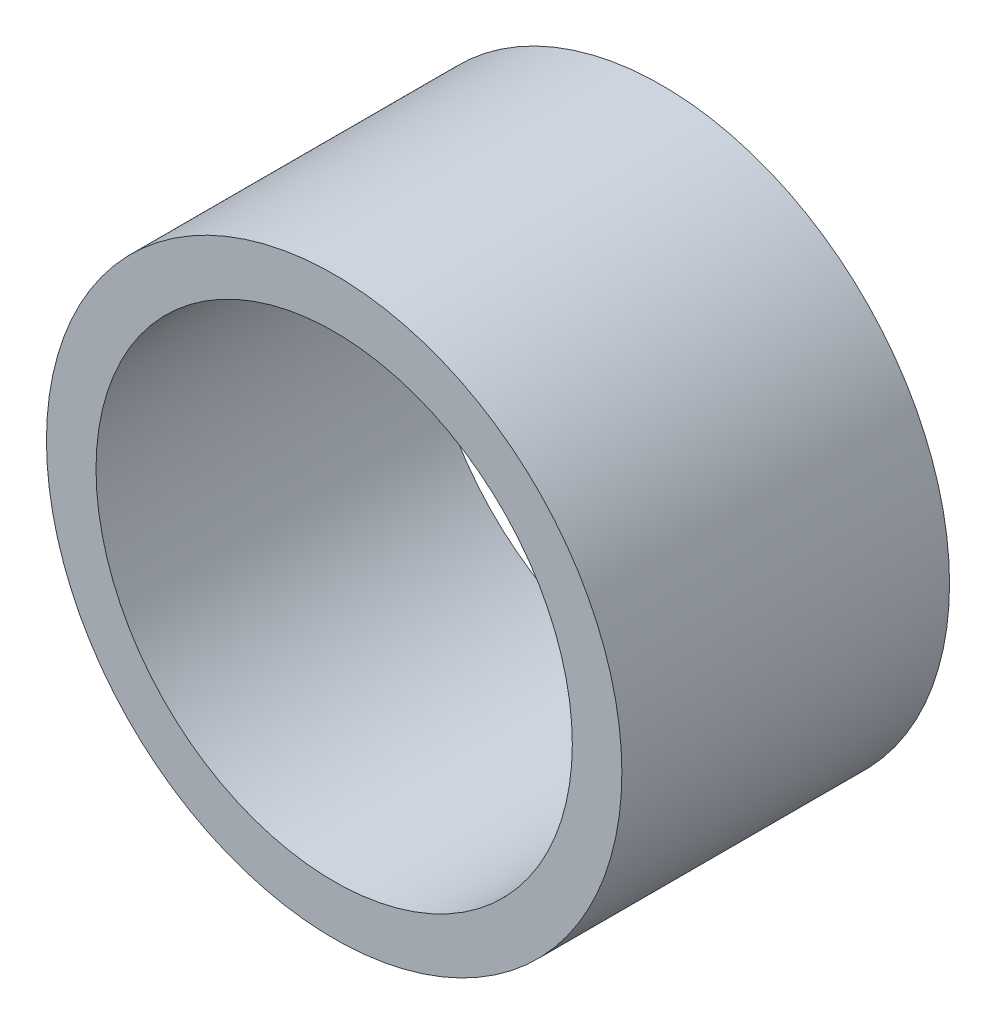
ISO-10303-21;
HEADER;
FILE_DESCRIPTION(('STEP AP214'),'2;1');
FILE_NAME('part.step','',(''),(''),'','','');
FILE_SCHEMA(('AUTOMOTIVE_DESIGN { 1 0 10303 214 1 1 1 1 }'));
ENDSEC;
DATA;
#1=APPLICATION_CONTEXT('core data for automotive mechanical design processes');
#2=APPLICATION_PROTOCOL_DEFINITION('international standard','automotive_design',2000,#1);
#3=PRODUCT_CONTEXT('',#1,'mechanical');
#4=PRODUCT('Part','Part','',(#3));
#5=PRODUCT_RELATED_PRODUCT_CATEGORY('part','',(#4));
#6=PRODUCT_DEFINITION_FORMATION('','',#4);
#7=PRODUCT_DEFINITION_CONTEXT('part definition',#1,'design');
#8=PRODUCT_DEFINITION('design','',#6,#7);
#9=PRODUCT_DEFINITION_SHAPE('','',#8);
#10=(LENGTH_UNIT() NAMED_UNIT(*) SI_UNIT(.MILLI.,.METRE.));
#11=(NAMED_UNIT(*) PLANE_ANGLE_UNIT() SI_UNIT($,.RADIAN.));
#12=(NAMED_UNIT(*) SI_UNIT($,.STERADIAN.) SOLID_ANGLE_UNIT());
#13=UNCERTAINTY_MEASURE_WITH_UNIT(LENGTH_MEASURE(1.E-05),#10,'distance_accuracy_value','');
#14=(GEOMETRIC_REPRESENTATION_CONTEXT(3) GLOBAL_UNCERTAINTY_ASSIGNED_CONTEXT((#13)) GLOBAL_UNIT_ASSIGNED_CONTEXT((#10,
#11,#12)) REPRESENTATION_CONTEXT('',''));
#15=CARTESIAN_POINT('',(0.,0.,0.));
#16=DIRECTION('',(0.,0.,1.));
#17=DIRECTION('',(1.,0.,0.));
#18=AXIS2_PLACEMENT_3D('',#15,#16,#17);
#19=CARTESIAN_POINT('',(0.,0.,41.));
#20=DIRECTION('',(0.,0.,1.));
#21=DIRECTION('',(1.,0.,0.));
#22=AXIS2_PLACEMENT_3D('',#19,#20,#21);
#23=PLANE('',#22);
#24=CARTESIAN_POINT('',(0.,0.,41.));
#25=DIRECTION('',(0.,0.,1.));
#26=DIRECTION('',(1.,0.,0.));
#27=AXIS2_PLACEMENT_3D('',#24,#25,#26);
#28=CIRCLE('',#27,36.);
#29=CARTESIAN_POINT('',(36.,0.,41.));
#30=VERTEX_POINT('',#29);
#31=EDGE_CURVE('E10',#30,#30,#28,.T.);
#32=ORIENTED_EDGE('',*,*,#31,.T.);
#33=EDGE_LOOP('',(#32));
#34=FACE_BOUND('',#33,.T.);
#35=CARTESIAN_POINT('',(0.,0.,41.));
#36=DIRECTION('',(0.,0.,1.));
#37=DIRECTION('',(1.,0.,0.));
#38=AXIS2_PLACEMENT_3D('',#35,#36,#37);
#39=CIRCLE('',#38,29.8);
#40=CARTESIAN_POINT('',(29.8,0.,41.));
#41=VERTEX_POINT('',#40);
#42=EDGE_CURVE('E54',#41,#41,#39,.T.);
#43=ORIENTED_EDGE('',*,*,#42,.F.);
#44=EDGE_LOOP('',(#43));
#45=FACE_BOUND('',#44,.T.);
#46=ADVANCED_FACE('F41',(#34,#45),#23,.T.);
#47=CARTESIAN_POINT('',(0.,0.,0.));
#48=DIRECTION('',(0.,0.,1.));
#49=DIRECTION('',(1.,0.,0.));
#50=AXIS2_PLACEMENT_3D('',#47,#48,#49);
#51=PLANE('',#50);
#52=CARTESIAN_POINT('',(0.,0.,0.));
#53=DIRECTION('',(0.,0.,1.));
#54=DIRECTION('',(1.,0.,0.));
#55=AXIS2_PLACEMENT_3D('',#52,#53,#54);
#56=CIRCLE('',#55,36.);
#57=CARTESIAN_POINT('',(36.,0.,0.));
#58=VERTEX_POINT('',#57);
#59=EDGE_CURVE('E45',#58,#58,#56,.T.);
#60=ORIENTED_EDGE('',*,*,#59,.F.);
#61=EDGE_LOOP('',(#60));
#62=FACE_BOUND('',#61,.T.);
#63=CARTESIAN_POINT('',(0.,0.,0.));
#64=DIRECTION('',(0.,0.,1.));
#65=DIRECTION('',(1.,0.,0.));
#66=AXIS2_PLACEMENT_3D('',#63,#64,#65);
#67=CIRCLE('',#66,29.8);
#68=CARTESIAN_POINT('',(29.8,0.,0.));
#69=VERTEX_POINT('',#68);
#70=EDGE_CURVE('E56',#69,#69,#67,.T.);
#71=ORIENTED_EDGE('',*,*,#70,.T.);
#72=EDGE_LOOP('',(#71));
#73=FACE_BOUND('',#72,.T.);
#74=ADVANCED_FACE('F68',(#62,#73),#51,.F.);
#75=CARTESIAN_POINT('',(0.,0.,41.));
#76=DIRECTION('',(0.,0.,-1.));
#77=DIRECTION('',(-1.,0.,0.));
#78=AXIS2_PLACEMENT_3D('',#75,#76,#77);
#79=CYLINDRICAL_SURFACE('',#78,36.);
#80=ORIENTED_EDGE('',*,*,#31,.F.);
#81=EDGE_LOOP('',(#80));
#82=FACE_BOUND('',#81,.T.);
#83=ORIENTED_EDGE('',*,*,#59,.T.);
#84=EDGE_LOOP('',(#83));
#85=FACE_BOUND('',#84,.T.);
#86=ADVANCED_FACE('F43',(#82,#85),#79,.T.);
#87=CARTESIAN_POINT('',(0.,0.,41.));
#88=DIRECTION('',(0.,0.,-1.));
#89=DIRECTION('',(-1.,0.,0.));
#90=AXIS2_PLACEMENT_3D('',#87,#88,#89);
#91=CYLINDRICAL_SURFACE('',#90,29.8);
#92=ORIENTED_EDGE('',*,*,#42,.T.);
#93=EDGE_LOOP('',(#92));
#94=FACE_BOUND('',#93,.T.);
#95=ORIENTED_EDGE('',*,*,#70,.F.);
#96=EDGE_LOOP('',(#95));
#97=FACE_BOUND('',#96,.T.);
#98=ADVANCED_FACE('F64',(#94,#97),#91,.F.);
#99=CLOSED_SHELL('',(#46,#74,#86,#98));
#100=MANIFOLD_SOLID_BREP('B2',#99);
#101=ADVANCED_BREP_SHAPE_REPRESENTATION('',(#18,#100),#14);
#102=SHAPE_DEFINITION_REPRESENTATION(#9,#101);
ENDSEC;
END-ISO-10303-21;
